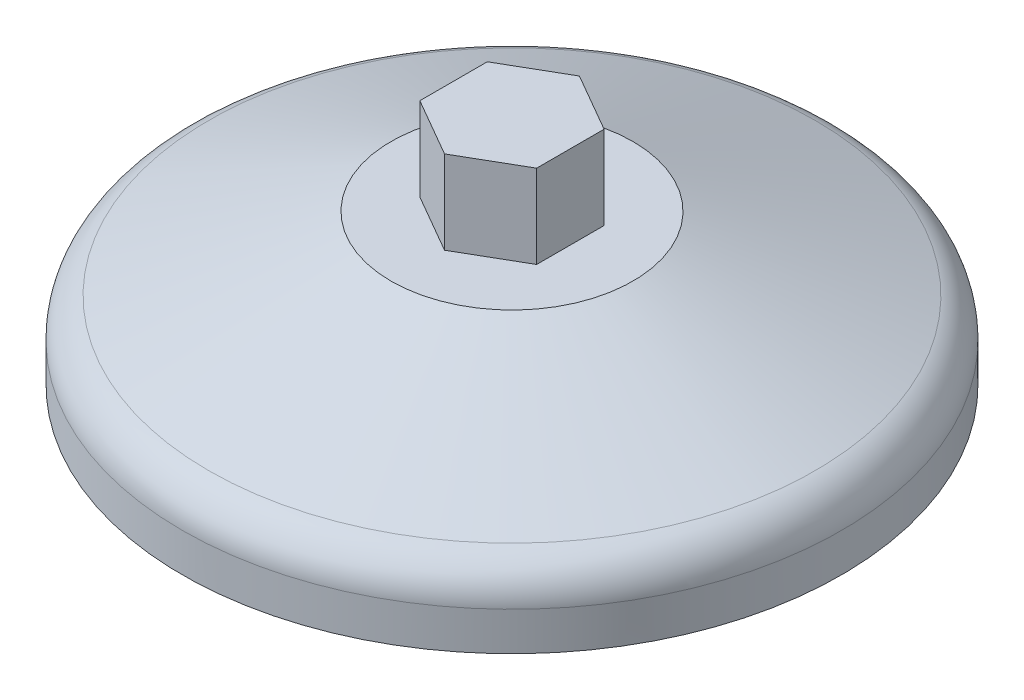
ISO-10303-21;
HEADER;
FILE_DESCRIPTION(('STEP AP214'),'2;1');
FILE_NAME('part.step','',(''),(''),'','','');
FILE_SCHEMA(('AUTOMOTIVE_DESIGN { 1 0 10303 214 1 1 1 1 }'));
ENDSEC;
DATA;
#1=APPLICATION_CONTEXT('core data for automotive mechanical design processes');
#2=APPLICATION_PROTOCOL_DEFINITION('international standard','automotive_design',2000,#1);
#3=PRODUCT_CONTEXT('',#1,'mechanical');
#4=PRODUCT('Part','Part','',(#3));
#5=PRODUCT_RELATED_PRODUCT_CATEGORY('part','',(#4));
#6=PRODUCT_DEFINITION_FORMATION('','',#4);
#7=PRODUCT_DEFINITION_CONTEXT('part definition',#1,'design');
#8=PRODUCT_DEFINITION('design','',#6,#7);
#9=PRODUCT_DEFINITION_SHAPE('','',#8);
#10=(LENGTH_UNIT() NAMED_UNIT(*) SI_UNIT(.MILLI.,.METRE.));
#11=(NAMED_UNIT(*) PLANE_ANGLE_UNIT() SI_UNIT($,.RADIAN.));
#12=(NAMED_UNIT(*) SI_UNIT($,.STERADIAN.) SOLID_ANGLE_UNIT());
#13=UNCERTAINTY_MEASURE_WITH_UNIT(LENGTH_MEASURE(1.E-05),#10,'distance_accuracy_value','');
#14=(GEOMETRIC_REPRESENTATION_CONTEXT(3) GLOBAL_UNCERTAINTY_ASSIGNED_CONTEXT((#13)) GLOBAL_UNIT_ASSIGNED_CONTEXT((#10,
#11,#12)) REPRESENTATION_CONTEXT('',''));
#15=CARTESIAN_POINT('',(0.,0.,0.));
#16=DIRECTION('',(0.,0.,1.));
#17=DIRECTION('',(1.,0.,0.));
#18=AXIS2_PLACEMENT_3D('',#15,#16,#17);
#19=CARTESIAN_POINT('',(-55.1774729901559,-58.5554283547376,-4.96013195530549));
#20=DIRECTION('',(0.,-1.,0.));
#21=DIRECTION('',(0.,0.,-1.));
#22=AXIS2_PLACEMENT_3D('',#19,#20,#21);
#23=CONICAL_SURFACE('',#22,39.5,1.19028994968253);
#24=CARTESIAN_POINT('',(-55.1774729901559,-57.2982097074458,-4.96013195530549));
#25=DIRECTION('',(0.,1.,0.));
#26=DIRECTION('',(0.,0.,1.));
#27=AXIS2_PLACEMENT_3D('',#24,#25,#26);
#28=CIRCLE('',#27,36.3569533817705);
#29=CARTESIAN_POINT('',(-55.1774729901559,-57.2982097074458,31.396821426465));
#30=VERTEX_POINT('',#29);
#31=EDGE_CURVE('E11',#30,#30,#28,.T.);
#32=ORIENTED_EDGE('',*,*,#31,.T.);
#33=EDGE_LOOP('',(#32));
#34=FACE_BOUND('',#33,.T.);
#35=CARTESIAN_POINT('',(-55.1774729901559,-48.5554283547376,-4.96013195530549));
#36=DIRECTION('',(0.,-1.,0.));
#37=DIRECTION('',(0.,0.,-1.));
#38=AXIS2_PLACEMENT_3D('',#35,#36,#37);
#39=CIRCLE('',#38,14.5);
#40=CARTESIAN_POINT('',(-55.1774729901559,-48.5554283547376,-19.4601319553055));
#41=VERTEX_POINT('',#40);
#42=EDGE_CURVE('E113',#41,#41,#39,.T.);
#43=ORIENTED_EDGE('',*,*,#42,.T.);
#44=EDGE_LOOP('',(#43));
#45=FACE_BOUND('',#44,.T.);
#46=ADVANCED_FACE('F37',(#34,#45),#23,.T.);
#47=CARTESIAN_POINT('',(-40.6774729901559,-48.5554283547376,-4.96013195530549));
#48=DIRECTION('',(0.,1.,0.));
#49=DIRECTION('',(0.,0.,1.));
#50=AXIS2_PLACEMENT_3D('',#47,#48,#49);
#51=PLANE('',#50);
#52=DIRECTION('',(0.866025403784438,0.,-0.500000000000001));
#53=VECTOR('',#52,1.);
#54=CARTESIAN_POINT('',(-48.1774729901559,-48.5554283547376,-0.918680070978194));
#55=LINE('',#54,#53);
#56=CARTESIAN_POINT('',(-55.1774729901559,-48.5554283547376,3.1227718133492));
#57=VERTEX_POINT('',#56);
#58=CARTESIAN_POINT('',(-48.1774729901559,-48.5554283547376,-0.918680070978194));
#59=VERTEX_POINT('',#58);
#60=EDGE_CURVE('E52',#57,#59,#55,.T.);
#61=ORIENTED_EDGE('',*,*,#60,.F.);
#62=DIRECTION('',(0.866025403784438,0.,0.500000000000001));
#63=VECTOR('',#62,1.);
#64=CARTESIAN_POINT('',(-55.1774729901559,-48.5554283547376,3.1227718133492));
#65=LINE('',#64,#63);
#66=CARTESIAN_POINT('',(-62.1774729901559,-48.5554283547376,-0.918680070978194));
#67=VERTEX_POINT('',#66);
#68=EDGE_CURVE('E56',#67,#57,#65,.T.);
#69=ORIENTED_EDGE('',*,*,#68,.F.);
#70=DIRECTION('',(0.,0.,1.));
#71=VECTOR('',#70,1.);
#72=CARTESIAN_POINT('',(-62.1774729901559,-48.5554283547376,-0.918680070978194));
#73=LINE('',#72,#71);
#74=CARTESIAN_POINT('',(-62.1774729901559,-48.5554283547376,-9.00158383963289));
#75=VERTEX_POINT('',#74);
#76=EDGE_CURVE('E173',#75,#67,#73,.T.);
#77=ORIENTED_EDGE('',*,*,#76,.F.);
#78=DIRECTION('',(-0.866025403784438,0.,0.500000000000002));
#79=VECTOR('',#78,1.);
#80=CARTESIAN_POINT('',(-62.1774729901559,-48.5554283547376,-9.00158383963289));
#81=LINE('',#80,#79);
#82=CARTESIAN_POINT('',(-55.1774729901559,-48.5554283547376,-13.0430357239603));
#83=VERTEX_POINT('',#82);
#84=EDGE_CURVE('E188',#83,#75,#81,.T.);
#85=ORIENTED_EDGE('',*,*,#84,.F.);
#86=DIRECTION('',(-0.866025403784438,0.,-0.500000000000002));
#87=VECTOR('',#86,1.);
#88=CARTESIAN_POINT('',(-55.1774729901559,-48.5554283547376,-13.0430357239603));
#89=LINE('',#88,#87);
#90=CARTESIAN_POINT('',(-48.1774729901559,-48.5554283547376,-9.00158383963289));
#91=VERTEX_POINT('',#90);
#92=EDGE_CURVE('E191',#91,#83,#89,.T.);
#93=ORIENTED_EDGE('',*,*,#92,.F.);
#94=DIRECTION('',(0.,0.,-1.));
#95=VECTOR('',#94,1.);
#96=CARTESIAN_POINT('',(-48.1774729901559,-48.5554283547376,-9.00158383963289));
#97=LINE('',#96,#95);
#98=EDGE_CURVE('E192',#59,#91,#97,.T.);
#99=ORIENTED_EDGE('',*,*,#98,.F.);
#100=EDGE_LOOP('',(#61,#69,#77,#85,#93,#99));
#101=FACE_BOUND('',#100,.T.);
#102=ORIENTED_EDGE('',*,*,#42,.F.);
#103=EDGE_LOOP('',(#102));
#104=FACE_BOUND('',#103,.T.);
#105=ADVANCED_FACE('F135',(#101,#104),#51,.T.);
#106=CARTESIAN_POINT('',(-55.1774729901559,-66.5554283547376,-4.96013195530549));
#107=DIRECTION('',(0.,-1.,0.));
#108=DIRECTION('',(0.,0.,-1.));
#109=AXIS2_PLACEMENT_3D('',#106,#107,#108);
#110=PLANE('',#109);
#111=CARTESIAN_POINT('',(-55.1774729901559,-66.5554283547376,-4.96013195530549));
#112=DIRECTION('',(0.,-1.,0.));
#113=DIRECTION('',(0.,0.,-1.));
#114=AXIS2_PLACEMENT_3D('',#111,#112,#113);
#115=CIRCLE('',#114,39.5);
#116=CARTESIAN_POINT('',(-55.1774729901559,-66.5554283547376,-44.4601319553055));
#117=VERTEX_POINT('',#116);
#118=EDGE_CURVE('E110',#117,#117,#115,.T.);
#119=ORIENTED_EDGE('',*,*,#118,.T.);
#120=EDGE_LOOP('',(#119));
#121=FACE_BOUND('',#120,.T.);
#122=ADVANCED_FACE('F140',(#121),#110,.T.);
#123=CARTESIAN_POINT('',(-55.1774729901559,-48.5554283547376,-4.96013195530549));
#124=DIRECTION('',(0.,-1.,0.));
#125=DIRECTION('',(0.,0.,-1.));
#126=AXIS2_PLACEMENT_3D('',#123,#124,#125);
#127=CYLINDRICAL_SURFACE('',#126,39.5);
#128=CARTESIAN_POINT('',(-55.1774729901559,-61.9405931618721,-4.96013195530549));
#129=DIRECTION('',(0.,1.,0.));
#130=DIRECTION('',(0.,0.,1.));
#131=AXIS2_PLACEMENT_3D('',#128,#129,#130);
#132=CIRCLE('',#131,39.5);
#133=CARTESIAN_POINT('',(-55.1774729901559,-61.9405931618721,34.5398680446945));
#134=VERTEX_POINT('',#133);
#135=EDGE_CURVE('E45',#134,#134,#132,.F.);
#136=ORIENTED_EDGE('',*,*,#135,.T.);
#137=EDGE_LOOP('',(#136));
#138=FACE_BOUND('',#137,.T.);
#139=ORIENTED_EDGE('',*,*,#118,.F.);
#140=EDGE_LOOP('',(#139));
#141=FACE_BOUND('',#140,.T.);
#142=ADVANCED_FACE('F123',(#138,#141),#127,.T.);
#143=CARTESIAN_POINT('',(-48.1774729901559,-38.5554283547376,-0.918680070978194));
#144=DIRECTION('',(-0.500000000000001,0.,-0.866025403784438));
#145=DIRECTION('',(-0.866025403784438,0.,0.500000000000001));
#146=AXIS2_PLACEMENT_3D('',#143,#144,#145);
#147=PLANE('',#146);
#148=ORIENTED_EDGE('',*,*,#60,.T.);
#149=DIRECTION('',(0.,-1.,0.));
#150=VECTOR('',#149,1.);
#151=CARTESIAN_POINT('',(-48.1774729901559,-38.5554283547376,-0.918680070978194));
#152=LINE('',#151,#150);
#153=CARTESIAN_POINT('',(-48.1774729901559,-38.5554283547376,-0.918680070978194));
#154=VERTEX_POINT('',#153);
#155=EDGE_CURVE('E93',#154,#59,#152,.T.);
#156=ORIENTED_EDGE('',*,*,#155,.F.);
#157=DIRECTION('',(0.866025403784438,0.,-0.500000000000001));
#158=VECTOR('',#157,1.);
#159=CARTESIAN_POINT('',(-48.1774729901559,-38.5554283547376,-0.918680070978194));
#160=LINE('',#159,#158);
#161=CARTESIAN_POINT('',(-55.1774729901559,-38.5554283547376,3.1227718133492));
#162=VERTEX_POINT('',#161);
#163=EDGE_CURVE('E99',#162,#154,#160,.T.);
#164=ORIENTED_EDGE('',*,*,#163,.F.);
#165=DIRECTION('',(0.,-1.,0.));
#166=VECTOR('',#165,1.);
#167=CARTESIAN_POINT('',(-55.1774729901559,-38.5554283547376,3.1227718133492));
#168=LINE('',#167,#166);
#169=EDGE_CURVE('E170',#162,#57,#168,.T.);
#170=ORIENTED_EDGE('',*,*,#169,.T.);
#171=EDGE_LOOP('',(#148,#156,#164,#170));
#172=FACE_BOUND('',#171,.T.);
#173=ADVANCED_FACE('F109',(#172),#147,.F.);
#174=CARTESIAN_POINT('',(-48.1774729901559,-38.5554283547376,-9.00158383963289));
#175=DIRECTION('',(-1.,0.,0.));
#176=DIRECTION('',(0.,0.,1.));
#177=AXIS2_PLACEMENT_3D('',#174,#175,#176);
#178=PLANE('',#177);
#179=ORIENTED_EDGE('',*,*,#98,.T.);
#180=DIRECTION('',(0.,-1.,0.));
#181=VECTOR('',#180,1.);
#182=CARTESIAN_POINT('',(-48.1774729901559,-38.5554283547376,-9.00158383963289));
#183=LINE('',#182,#181);
#184=CARTESIAN_POINT('',(-48.1774729901559,-38.5554283547376,-9.00158383963289));
#185=VERTEX_POINT('',#184);
#186=EDGE_CURVE('E95',#185,#91,#183,.T.);
#187=ORIENTED_EDGE('',*,*,#186,.F.);
#188=DIRECTION('',(0.,0.,-1.));
#189=VECTOR('',#188,1.);
#190=CARTESIAN_POINT('',(-48.1774729901559,-38.5554283547376,-9.00158383963289));
#191=LINE('',#190,#189);
#192=EDGE_CURVE('E88',#154,#185,#191,.T.);
#193=ORIENTED_EDGE('',*,*,#192,.F.);
#194=ORIENTED_EDGE('',*,*,#155,.T.);
#195=EDGE_LOOP('',(#179,#187,#193,#194));
#196=FACE_BOUND('',#195,.T.);
#197=ADVANCED_FACE('F91',(#196),#178,.F.);
#198=CARTESIAN_POINT('',(-55.1774729901559,-38.5554283547376,-13.0430357239603));
#199=DIRECTION('',(-0.500000000000002,0.,0.866025403784438));
#200=DIRECTION('',(0.866025403784438,0.,0.500000000000002));
#201=AXIS2_PLACEMENT_3D('',#198,#199,#200);
#202=PLANE('',#201);
#203=ORIENTED_EDGE('',*,*,#92,.T.);
#204=DIRECTION('',(0.,-1.,0.));
#205=VECTOR('',#204,1.);
#206=CARTESIAN_POINT('',(-55.1774729901559,-38.5554283547376,-13.0430357239603));
#207=LINE('',#206,#205);
#208=CARTESIAN_POINT('',(-55.1774729901559,-38.5554283547376,-13.0430357239603));
#209=VERTEX_POINT('',#208);
#210=EDGE_CURVE('E115',#209,#83,#207,.T.);
#211=ORIENTED_EDGE('',*,*,#210,.F.);
#212=DIRECTION('',(-0.866025403784438,0.,-0.500000000000002));
#213=VECTOR('',#212,1.);
#214=CARTESIAN_POINT('',(-55.1774729901559,-38.5554283547376,-13.0430357239603));
#215=LINE('',#214,#213);
#216=EDGE_CURVE('E98',#185,#209,#215,.T.);
#217=ORIENTED_EDGE('',*,*,#216,.F.);
#218=ORIENTED_EDGE('',*,*,#186,.T.);
#219=EDGE_LOOP('',(#203,#211,#217,#218));
#220=FACE_BOUND('',#219,.T.);
#221=ADVANCED_FACE('F153',(#220),#202,.F.);
#222=CARTESIAN_POINT('',(-62.1774729901559,-38.5554283547376,-9.00158383963289));
#223=DIRECTION('',(0.500000000000002,0.,0.866025403784438));
#224=DIRECTION('',(0.866025403784438,0.,-0.500000000000002));
#225=AXIS2_PLACEMENT_3D('',#222,#223,#224);
#226=PLANE('',#225);
#227=ORIENTED_EDGE('',*,*,#84,.T.);
#228=DIRECTION('',(0.,-1.,0.));
#229=VECTOR('',#228,1.);
#230=CARTESIAN_POINT('',(-62.1774729901559,-38.5554283547376,-9.00158383963289));
#231=LINE('',#230,#229);
#232=CARTESIAN_POINT('',(-62.1774729901559,-38.5554283547376,-9.00158383963289));
#233=VERTEX_POINT('',#232);
#234=EDGE_CURVE('E176',#233,#75,#231,.T.);
#235=ORIENTED_EDGE('',*,*,#234,.F.);
#236=DIRECTION('',(-0.866025403784438,0.,0.500000000000002));
#237=VECTOR('',#236,1.);
#238=CARTESIAN_POINT('',(-62.1774729901559,-38.5554283547376,-9.00158383963289));
#239=LINE('',#238,#237);
#240=EDGE_CURVE('E189',#209,#233,#239,.T.);
#241=ORIENTED_EDGE('',*,*,#240,.F.);
#242=ORIENTED_EDGE('',*,*,#210,.T.);
#243=EDGE_LOOP('',(#227,#235,#241,#242));
#244=FACE_BOUND('',#243,.T.);
#245=ADVANCED_FACE('F156',(#244),#226,.F.);
#246=CARTESIAN_POINT('',(-62.1774729901559,-38.5554283547376,-0.918680070978194));
#247=DIRECTION('',(1.,0.,0.));
#248=DIRECTION('',(0.,0.,-1.));
#249=AXIS2_PLACEMENT_3D('',#246,#247,#248);
#250=PLANE('',#249);
#251=ORIENTED_EDGE('',*,*,#76,.T.);
#252=DIRECTION('',(0.,-1.,0.));
#253=VECTOR('',#252,1.);
#254=CARTESIAN_POINT('',(-62.1774729901559,-38.5554283547376,-0.918680070978194));
#255=LINE('',#254,#253);
#256=CARTESIAN_POINT('',(-62.1774729901559,-38.5554283547376,-0.918680070978194));
#257=VERTEX_POINT('',#256);
#258=EDGE_CURVE('E172',#257,#67,#255,.T.);
#259=ORIENTED_EDGE('',*,*,#258,.F.);
#260=DIRECTION('',(0.,0.,1.));
#261=VECTOR('',#260,1.);
#262=CARTESIAN_POINT('',(-62.1774729901559,-38.5554283547376,-0.918680070978194));
#263=LINE('',#262,#261);
#264=EDGE_CURVE('E178',#233,#257,#263,.T.);
#265=ORIENTED_EDGE('',*,*,#264,.F.);
#266=ORIENTED_EDGE('',*,*,#234,.T.);
#267=EDGE_LOOP('',(#251,#259,#265,#266));
#268=FACE_BOUND('',#267,.T.);
#269=ADVANCED_FACE('F160',(#268),#250,.F.);
#270=CARTESIAN_POINT('',(-55.1774729901559,-38.5554283547376,3.1227718133492));
#271=DIRECTION('',(0.500000000000001,0.,-0.866025403784438));
#272=DIRECTION('',(-0.866025403784438,0.,-0.500000000000001));
#273=AXIS2_PLACEMENT_3D('',#270,#271,#272);
#274=PLANE('',#273);
#275=ORIENTED_EDGE('',*,*,#68,.T.);
#276=ORIENTED_EDGE('',*,*,#169,.F.);
#277=DIRECTION('',(0.866025403784438,0.,0.500000000000001));
#278=VECTOR('',#277,1.);
#279=CARTESIAN_POINT('',(-55.1774729901559,-38.5554283547376,3.1227718133492));
#280=LINE('',#279,#278);
#281=EDGE_CURVE('E104',#257,#162,#280,.T.);
#282=ORIENTED_EDGE('',*,*,#281,.F.);
#283=ORIENTED_EDGE('',*,*,#258,.T.);
#284=EDGE_LOOP('',(#275,#276,#282,#283));
#285=FACE_BOUND('',#284,.T.);
#286=ADVANCED_FACE('F131',(#285),#274,.F.);
#287=CARTESIAN_POINT('',(0.,-38.5554283547376,0.));
#288=DIRECTION('',(0.,-1.,0.));
#289=DIRECTION('',(0.,0.,-1.));
#290=AXIS2_PLACEMENT_3D('',#287,#288,#289);
#291=PLANE('',#290);
#292=ORIENTED_EDGE('',*,*,#163,.T.);
#293=ORIENTED_EDGE('',*,*,#192,.T.);
#294=ORIENTED_EDGE('',*,*,#216,.T.);
#295=ORIENTED_EDGE('',*,*,#240,.T.);
#296=ORIENTED_EDGE('',*,*,#264,.T.);
#297=ORIENTED_EDGE('',*,*,#281,.T.);
#298=EDGE_LOOP('',(#292,#293,#294,#295,#296,#297));
#299=FACE_BOUND('',#298,.T.);
#300=ADVANCED_FACE('F102',(#299),#291,.F.);
#301=CARTESIAN_POINT('',(-55.1774729901559,-61.9405931618721,-4.96013195530549));
#302=DIRECTION('',(0.,1.,0.));
#303=DIRECTION('',(0.,0.,1.));
#304=AXIS2_PLACEMENT_3D('',#301,#302,#303);
#305=TOROIDAL_SURFACE('',#304,34.5,5.);
#306=ORIENTED_EDGE('',*,*,#31,.F.);
#307=EDGE_LOOP('',(#306));
#308=FACE_BOUND('',#307,.T.);
#309=ORIENTED_EDGE('',*,*,#135,.F.);
#310=EDGE_LOOP('',(#309));
#311=FACE_BOUND('',#310,.T.);
#312=ADVANCED_FACE('F39',(#308,#311),#305,.T.);
#313=CLOSED_SHELL('',(#46,#105,#122,#142,#173,#197,#221,#245,#269,#286,#300,#312));
#314=MANIFOLD_SOLID_BREP('B2',#313);
#315=ADVANCED_BREP_SHAPE_REPRESENTATION('',(#18,#314),#14);
#316=SHAPE_DEFINITION_REPRESENTATION(#9,#315);
ENDSEC;
END-ISO-10303-21;
